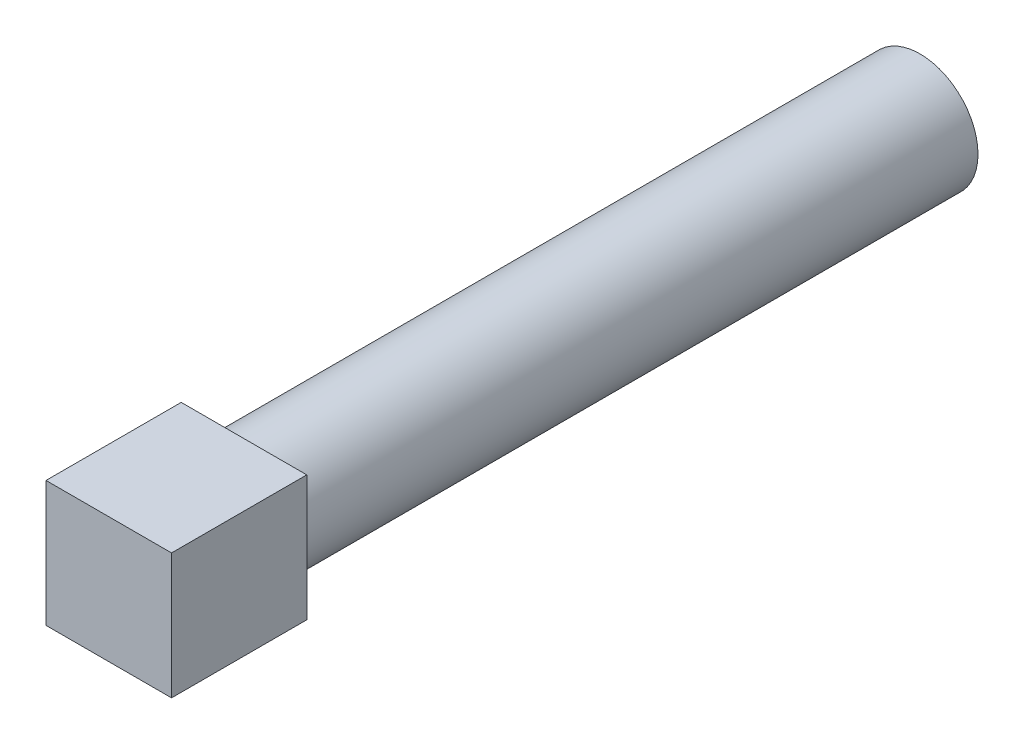
ISO-10303-21;
HEADER;
FILE_DESCRIPTION(('STEP AP214'),'2;1');
FILE_NAME('part.step','',(''),(''),'','','');
FILE_SCHEMA(('AUTOMOTIVE_DESIGN { 1 0 10303 214 1 1 1 1 }'));
ENDSEC;
DATA;
#1=APPLICATION_CONTEXT('core data for automotive mechanical design processes');
#2=APPLICATION_PROTOCOL_DEFINITION('international standard','automotive_design',2000,#1);
#3=PRODUCT_CONTEXT('',#1,'mechanical');
#4=PRODUCT('Part','Part','',(#3));
#5=PRODUCT_RELATED_PRODUCT_CATEGORY('part','',(#4));
#6=PRODUCT_DEFINITION_FORMATION('','',#4);
#7=PRODUCT_DEFINITION_CONTEXT('part definition',#1,'design');
#8=PRODUCT_DEFINITION('design','',#6,#7);
#9=PRODUCT_DEFINITION_SHAPE('','',#8);
#10=(LENGTH_UNIT() NAMED_UNIT(*) SI_UNIT(.MILLI.,.METRE.));
#11=(NAMED_UNIT(*) PLANE_ANGLE_UNIT() SI_UNIT($,.RADIAN.));
#12=(NAMED_UNIT(*) SI_UNIT($,.STERADIAN.) SOLID_ANGLE_UNIT());
#13=UNCERTAINTY_MEASURE_WITH_UNIT(LENGTH_MEASURE(1.E-05),#10,'distance_accuracy_value','');
#14=(GEOMETRIC_REPRESENTATION_CONTEXT(3) GLOBAL_UNCERTAINTY_ASSIGNED_CONTEXT((#13)) GLOBAL_UNIT_ASSIGNED_CONTEXT((#10,
#11,#12)) REPRESENTATION_CONTEXT('',''));
#15=CARTESIAN_POINT('',(0.,0.,0.));
#16=DIRECTION('',(0.,0.,1.));
#17=DIRECTION('',(1.,0.,0.));
#18=AXIS2_PLACEMENT_3D('',#15,#16,#17);
#19=CARTESIAN_POINT('',(0.,0.,70.));
#20=DIRECTION('',(0.,0.,-1.));
#21=DIRECTION('',(-1.,0.,0.));
#22=AXIS2_PLACEMENT_3D('',#19,#20,#21);
#23=CYLINDRICAL_SURFACE('',#22,6.);
#24=CARTESIAN_POINT('',(0.,0.,70.));
#25=DIRECTION('',(0.,0.,1.));
#26=DIRECTION('',(1.,0.,0.));
#27=AXIS2_PLACEMENT_3D('',#24,#25,#26);
#28=CIRCLE('',#27,6.);
#29=CARTESIAN_POINT('',(6.,0.,70.));
#30=VERTEX_POINT('',#29);
#31=EDGE_CURVE('E11',#30,#30,#28,.T.);
#32=ORIENTED_EDGE('',*,*,#31,.F.);
#33=EDGE_LOOP('',(#32));
#34=FACE_BOUND('',#33,.T.);
#35=CARTESIAN_POINT('',(0.,0.,0.));
#36=DIRECTION('',(0.,0.,1.));
#37=DIRECTION('',(1.,0.,0.));
#38=AXIS2_PLACEMENT_3D('',#35,#36,#37);
#39=CIRCLE('',#38,6.);
#40=CARTESIAN_POINT('',(6.,0.,0.));
#41=VERTEX_POINT('',#40);
#42=EDGE_CURVE('E40',#41,#41,#39,.T.);
#43=ORIENTED_EDGE('',*,*,#42,.T.);
#44=EDGE_LOOP('',(#43));
#45=FACE_BOUND('',#44,.T.);
#46=ADVANCED_FACE('F37',(#34,#45),#23,.T.);
#47=CARTESIAN_POINT('',(0.,0.,0.));
#48=DIRECTION('',(0.,0.,1.));
#49=DIRECTION('',(1.,0.,0.));
#50=AXIS2_PLACEMENT_3D('',#47,#48,#49);
#51=PLANE('',#50);
#52=ORIENTED_EDGE('',*,*,#42,.F.);
#53=EDGE_LOOP('',(#52));
#54=FACE_BOUND('',#53,.T.);
#55=ADVANCED_FACE('F126',(#54),#51,.F.);
#56=CARTESIAN_POINT('',(6.5,6.5,51.6152236891498));
#57=DIRECTION('',(1.,0.,0.));
#58=DIRECTION('',(0.,0.,-1.));
#59=AXIS2_PLACEMENT_3D('',#56,#57,#58);
#60=PLANE('',#59);
#61=DIRECTION('',(0.,-1.,0.));
#62=VECTOR('',#61,1.);
#63=CARTESIAN_POINT('',(6.5,6.5,70.));
#64=LINE('',#63,#62);
#65=CARTESIAN_POINT('',(6.5,6.5,70.));
#66=VERTEX_POINT('',#65);
#67=CARTESIAN_POINT('',(6.5,-6.5,70.));
#68=VERTEX_POINT('',#67);
#69=EDGE_CURVE('E81',#66,#68,#64,.T.);
#70=ORIENTED_EDGE('',*,*,#69,.F.);
#71=DIRECTION('',(0.,0.,1.));
#72=VECTOR('',#71,1.);
#73=CARTESIAN_POINT('',(6.5,6.5,51.6152236891498));
#74=LINE('',#73,#72);
#75=CARTESIAN_POINT('',(6.5,6.5,84.));
#76=VERTEX_POINT('',#75);
#77=EDGE_CURVE('E74',#66,#76,#74,.T.);
#78=ORIENTED_EDGE('',*,*,#77,.T.);
#79=DIRECTION('',(0.,1.,0.));
#80=VECTOR('',#79,1.);
#81=CARTESIAN_POINT('',(6.5,6.5,84.));
#82=LINE('',#81,#80);
#83=CARTESIAN_POINT('',(6.5,-6.5,84.));
#84=VERTEX_POINT('',#83);
#85=EDGE_CURVE('E79',#84,#76,#82,.T.);
#86=ORIENTED_EDGE('',*,*,#85,.F.);
#87=DIRECTION('',(0.,0.,1.));
#88=VECTOR('',#87,1.);
#89=CARTESIAN_POINT('',(6.5,-6.5,51.6152236891498));
#90=LINE('',#89,#88);
#91=EDGE_CURVE('E104',#68,#84,#90,.T.);
#92=ORIENTED_EDGE('',*,*,#91,.F.);
#93=EDGE_LOOP('',(#70,#78,#86,#92));
#94=FACE_BOUND('',#93,.T.);
#95=ADVANCED_FACE('F76',(#94),#60,.T.);
#96=CARTESIAN_POINT('',(-6.5,-6.5,51.6152236891498));
#97=DIRECTION('',(0.,-1.,0.));
#98=DIRECTION('',(0.,0.,-1.));
#99=AXIS2_PLACEMENT_3D('',#96,#97,#98);
#100=PLANE('',#99);
#101=DIRECTION('',(-1.,0.,0.));
#102=VECTOR('',#101,1.);
#103=CARTESIAN_POINT('',(-6.5,-6.5,70.));
#104=LINE('',#103,#102);
#105=CARTESIAN_POINT('',(-6.5,-6.5,70.));
#106=VERTEX_POINT('',#105);
#107=EDGE_CURVE('E51',#68,#106,#104,.T.);
#108=ORIENTED_EDGE('',*,*,#107,.F.);
#109=ORIENTED_EDGE('',*,*,#91,.T.);
#110=DIRECTION('',(1.,0.,0.));
#111=VECTOR('',#110,1.);
#112=CARTESIAN_POINT('',(-6.5,-6.5,84.));
#113=LINE('',#112,#111);
#114=CARTESIAN_POINT('',(-6.5,-6.5,84.));
#115=VERTEX_POINT('',#114);
#116=EDGE_CURVE('E85',#115,#84,#113,.T.);
#117=ORIENTED_EDGE('',*,*,#116,.F.);
#118=DIRECTION('',(0.,0.,1.));
#119=VECTOR('',#118,1.);
#120=CARTESIAN_POINT('',(-6.5,-6.5,51.6152236891498));
#121=LINE('',#120,#119);
#122=EDGE_CURVE('E107',#106,#115,#121,.T.);
#123=ORIENTED_EDGE('',*,*,#122,.F.);
#124=EDGE_LOOP('',(#108,#109,#117,#123));
#125=FACE_BOUND('',#124,.T.);
#126=ADVANCED_FACE('F118',(#125),#100,.T.);
#127=CARTESIAN_POINT('',(-6.5,6.5,51.6152236891498));
#128=DIRECTION('',(-1.,0.,0.));
#129=DIRECTION('',(0.,-1.,0.));
#130=AXIS2_PLACEMENT_3D('',#127,#128,#129);
#131=PLANE('',#130);
#132=DIRECTION('',(0.,1.,0.));
#133=VECTOR('',#132,1.);
#134=CARTESIAN_POINT('',(-6.5,6.5,70.));
#135=LINE('',#134,#133);
#136=CARTESIAN_POINT('',(-6.5,6.5,70.));
#137=VERTEX_POINT('',#136);
#138=EDGE_CURVE('E106',#106,#137,#135,.T.);
#139=ORIENTED_EDGE('',*,*,#138,.F.);
#140=ORIENTED_EDGE('',*,*,#122,.T.);
#141=DIRECTION('',(0.,-1.,0.));
#142=VECTOR('',#141,1.);
#143=CARTESIAN_POINT('',(-6.5,6.5,84.));
#144=LINE('',#143,#142);
#145=CARTESIAN_POINT('',(-6.5,6.5,84.));
#146=VERTEX_POINT('',#145);
#147=EDGE_CURVE('E94',#146,#115,#144,.T.);
#148=ORIENTED_EDGE('',*,*,#147,.F.);
#149=DIRECTION('',(0.,0.,1.));
#150=VECTOR('',#149,1.);
#151=CARTESIAN_POINT('',(-6.5,6.5,51.6152236891498));
#152=LINE('',#151,#150);
#153=EDGE_CURVE('E84',#137,#146,#152,.T.);
#154=ORIENTED_EDGE('',*,*,#153,.F.);
#155=EDGE_LOOP('',(#139,#140,#148,#154));
#156=FACE_BOUND('',#155,.T.);
#157=ADVANCED_FACE('F116',(#156),#131,.T.);
#158=CARTESIAN_POINT('',(-6.5,6.5,51.6152236891498));
#159=DIRECTION('',(0.,1.,0.));
#160=DIRECTION('',(0.,0.,1.));
#161=AXIS2_PLACEMENT_3D('',#158,#159,#160);
#162=PLANE('',#161);
#163=DIRECTION('',(1.,0.,0.));
#164=VECTOR('',#163,1.);
#165=CARTESIAN_POINT('',(-6.5,6.5,70.));
#166=LINE('',#165,#164);
#167=EDGE_CURVE('E110',#137,#66,#166,.T.);
#168=ORIENTED_EDGE('',*,*,#167,.F.);
#169=ORIENTED_EDGE('',*,*,#153,.T.);
#170=DIRECTION('',(-1.,0.,0.));
#171=VECTOR('',#170,1.);
#172=CARTESIAN_POINT('',(-6.5,6.5,84.));
#173=LINE('',#172,#171);
#174=EDGE_CURVE('E88',#76,#146,#173,.T.);
#175=ORIENTED_EDGE('',*,*,#174,.F.);
#176=ORIENTED_EDGE('',*,*,#77,.F.);
#177=EDGE_LOOP('',(#168,#169,#175,#176));
#178=FACE_BOUND('',#177,.T.);
#179=ADVANCED_FACE('F89',(#178),#162,.T.);
#180=CARTESIAN_POINT('',(0.,0.,84.));
#181=DIRECTION('',(0.,0.,1.));
#182=DIRECTION('',(1.,0.,0.));
#183=AXIS2_PLACEMENT_3D('',#180,#181,#182);
#184=PLANE('',#183);
#185=ORIENTED_EDGE('',*,*,#85,.T.);
#186=ORIENTED_EDGE('',*,*,#174,.T.);
#187=ORIENTED_EDGE('',*,*,#147,.T.);
#188=ORIENTED_EDGE('',*,*,#116,.T.);
#189=EDGE_LOOP('',(#185,#186,#187,#188));
#190=FACE_BOUND('',#189,.T.);
#191=ADVANCED_FACE('F96',(#190),#184,.T.);
#192=CARTESIAN_POINT('',(0.,0.,70.));
#193=DIRECTION('',(0.,0.,1.));
#194=DIRECTION('',(1.,0.,0.));
#195=AXIS2_PLACEMENT_3D('',#192,#193,#194);
#196=PLANE('',#195);
#197=ORIENTED_EDGE('',*,*,#31,.T.);
#198=EDGE_LOOP('',(#197));
#199=FACE_BOUND('',#198,.T.);
#200=ORIENTED_EDGE('',*,*,#69,.T.);
#201=ORIENTED_EDGE('',*,*,#107,.T.);
#202=ORIENTED_EDGE('',*,*,#138,.T.);
#203=ORIENTED_EDGE('',*,*,#167,.T.);
#204=EDGE_LOOP('',(#200,#201,#202,#203));
#205=FACE_BOUND('',#204,.T.);
#206=ADVANCED_FACE('F113',(#199,#205),#196,.F.);
#207=CLOSED_SHELL('',(#46,#55,#95,#126,#157,#179,#191,#206));
#208=MANIFOLD_SOLID_BREP('B2',#207);
#209=ADVANCED_BREP_SHAPE_REPRESENTATION('',(#18,#208),#14);
#210=SHAPE_DEFINITION_REPRESENTATION(#9,#209);
ENDSEC;
END-ISO-10303-21;
